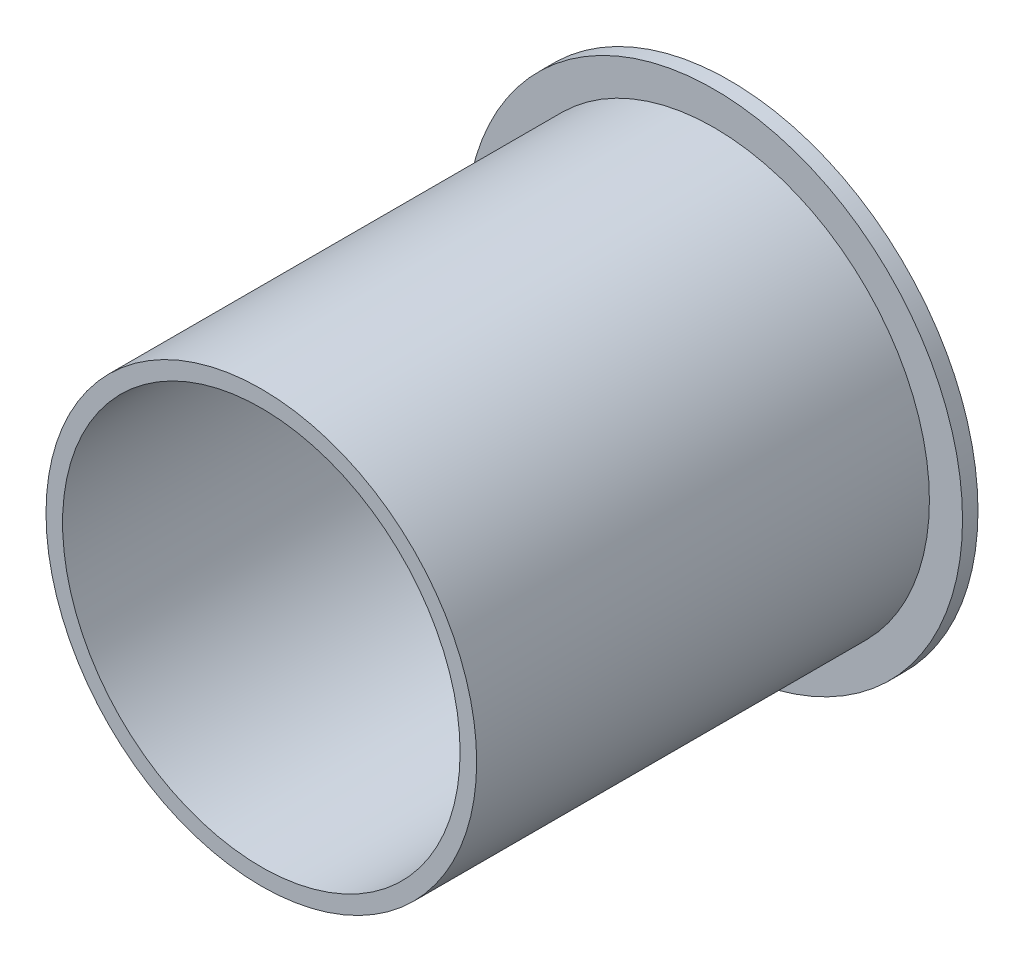
ISO-10303-21;
HEADER;
FILE_DESCRIPTION(('STEP AP214'),'2;1');
FILE_NAME('part.step','',(''),(''),'','','');
FILE_SCHEMA(('AUTOMOTIVE_DESIGN { 1 0 10303 214 1 1 1 1 }'));
ENDSEC;
DATA;
#1=APPLICATION_CONTEXT('core data for automotive mechanical design processes');
#2=APPLICATION_PROTOCOL_DEFINITION('international standard','automotive_design',2000,#1);
#3=PRODUCT_CONTEXT('',#1,'mechanical');
#4=PRODUCT('Part','Part','',(#3));
#5=PRODUCT_RELATED_PRODUCT_CATEGORY('part','',(#4));
#6=PRODUCT_DEFINITION_FORMATION('','',#4);
#7=PRODUCT_DEFINITION_CONTEXT('part definition',#1,'design');
#8=PRODUCT_DEFINITION('design','',#6,#7);
#9=PRODUCT_DEFINITION_SHAPE('','',#8);
#10=(LENGTH_UNIT() NAMED_UNIT(*) SI_UNIT(.MILLI.,.METRE.));
#11=(NAMED_UNIT(*) PLANE_ANGLE_UNIT() SI_UNIT($,.RADIAN.));
#12=(NAMED_UNIT(*) SI_UNIT($,.STERADIAN.) SOLID_ANGLE_UNIT());
#13=UNCERTAINTY_MEASURE_WITH_UNIT(LENGTH_MEASURE(1.E-05),#10,'distance_accuracy_value','');
#14=(GEOMETRIC_REPRESENTATION_CONTEXT(3) GLOBAL_UNCERTAINTY_ASSIGNED_CONTEXT((#13)) GLOBAL_UNIT_ASSIGNED_CONTEXT((#10,
#11,#12)) REPRESENTATION_CONTEXT('',''));
#15=CARTESIAN_POINT('',(0.,0.,0.));
#16=DIRECTION('',(0.,0.,1.));
#17=DIRECTION('',(1.,0.,0.));
#18=AXIS2_PLACEMENT_3D('',#15,#16,#17);
#19=CARTESIAN_POINT('',(0.,0.,1.4));
#20=DIRECTION('',(0.,0.,-1.));
#21=DIRECTION('',(-1.,0.,0.));
#22=AXIS2_PLACEMENT_3D('',#19,#20,#21);
#23=CYLINDRICAL_SURFACE('',#22,22.5);
#24=CARTESIAN_POINT('',(0.,0.,1.4));
#25=DIRECTION('',(0.,0.,1.));
#26=DIRECTION('',(1.,0.,0.));
#27=AXIS2_PLACEMENT_3D('',#24,#25,#26);
#28=CIRCLE('',#27,22.5);
#29=CARTESIAN_POINT('',(22.5,0.,1.4));
#30=VERTEX_POINT('',#29);
#31=EDGE_CURVE('E41',#30,#30,#28,.T.);
#32=ORIENTED_EDGE('',*,*,#31,.F.);
#33=EDGE_LOOP('',(#32));
#34=FACE_BOUND('',#33,.T.);
#35=CARTESIAN_POINT('',(0.,0.,0.));
#36=DIRECTION('',(0.,0.,1.));
#37=DIRECTION('',(1.,0.,0.));
#38=AXIS2_PLACEMENT_3D('',#35,#36,#37);
#39=CIRCLE('',#38,22.5);
#40=CARTESIAN_POINT('',(22.5,0.,0.));
#41=VERTEX_POINT('',#40);
#42=EDGE_CURVE('E45',#41,#41,#39,.T.);
#43=ORIENTED_EDGE('',*,*,#42,.T.);
#44=EDGE_LOOP('',(#43));
#45=FACE_BOUND('',#44,.T.);
#46=ADVANCED_FACE('F35',(#34,#45),#23,.T.);
#47=CARTESIAN_POINT('',(0.,0.,1.4));
#48=DIRECTION('',(0.,0.,1.));
#49=DIRECTION('',(1.,0.,0.));
#50=AXIS2_PLACEMENT_3D('',#47,#48,#49);
#51=PLANE('',#50);
#52=CARTESIAN_POINT('',(0.,0.,1.4));
#53=DIRECTION('',(0.,0.,1.));
#54=DIRECTION('',(1.,0.,0.));
#55=AXIS2_PLACEMENT_3D('',#52,#53,#54);
#56=CIRCLE('',#55,19.5);
#57=CARTESIAN_POINT('',(19.5,0.,1.4));
#58=VERTEX_POINT('',#57);
#59=EDGE_CURVE('E52',#58,#58,#56,.T.);
#60=ORIENTED_EDGE('',*,*,#59,.F.);
#61=EDGE_LOOP('',(#60));
#62=FACE_BOUND('',#61,.T.);
#63=ORIENTED_EDGE('',*,*,#31,.T.);
#64=EDGE_LOOP('',(#63));
#65=FACE_BOUND('',#64,.T.);
#66=ADVANCED_FACE('F74',(#62,#65),#51,.T.);
#67=CARTESIAN_POINT('',(0.,0.,0.));
#68=DIRECTION('',(0.,0.,1.));
#69=DIRECTION('',(1.,0.,0.));
#70=AXIS2_PLACEMENT_3D('',#67,#68,#69);
#71=PLANE('',#70);
#72=CARTESIAN_POINT('',(0.,0.,0.));
#73=DIRECTION('',(0.,0.,1.));
#74=DIRECTION('',(1.,0.,0.));
#75=AXIS2_PLACEMENT_3D('',#72,#73,#74);
#76=CIRCLE('',#75,17.);
#77=CARTESIAN_POINT('',(17.,0.,0.));
#78=VERTEX_POINT('',#77);
#79=EDGE_CURVE('E60',#78,#78,#76,.F.);
#80=ORIENTED_EDGE('',*,*,#79,.F.);
#81=EDGE_LOOP('',(#80));
#82=FACE_BOUND('',#81,.T.);
#83=ORIENTED_EDGE('',*,*,#42,.F.);
#84=EDGE_LOOP('',(#83));
#85=FACE_BOUND('',#84,.T.);
#86=ADVANCED_FACE('F86',(#82,#85),#71,.F.);
#87=CARTESIAN_POINT('',(0.,0.,42.4));
#88=DIRECTION('',(0.,0.,1.));
#89=DIRECTION('',(1.,0.,0.));
#90=AXIS2_PLACEMENT_3D('',#87,#88,#89);
#91=PLANE('',#90);
#92=CARTESIAN_POINT('',(0.,0.,42.4));
#93=DIRECTION('',(0.,0.,1.));
#94=DIRECTION('',(1.,0.,0.));
#95=AXIS2_PLACEMENT_3D('',#92,#93,#94);
#96=CIRCLE('',#95,19.5);
#97=CARTESIAN_POINT('',(19.5,0.,42.4));
#98=VERTEX_POINT('',#97);
#99=EDGE_CURVE('E50',#98,#98,#96,.T.);
#100=ORIENTED_EDGE('',*,*,#99,.T.);
#101=EDGE_LOOP('',(#100));
#102=FACE_BOUND('',#101,.T.);
#103=CARTESIAN_POINT('',(0.,0.,42.4));
#104=DIRECTION('',(0.,0.,1.));
#105=DIRECTION('',(1.,0.,0.));
#106=AXIS2_PLACEMENT_3D('',#103,#104,#105);
#107=CIRCLE('',#106,18.);
#108=CARTESIAN_POINT('',(18.,0.,42.4));
#109=VERTEX_POINT('',#108);
#110=EDGE_CURVE('E55',#109,#109,#107,.T.);
#111=ORIENTED_EDGE('',*,*,#110,.F.);
#112=EDGE_LOOP('',(#111));
#113=FACE_BOUND('',#112,.T.);
#114=ADVANCED_FACE('F96',(#102,#113),#91,.T.);
#115=CARTESIAN_POINT('',(0.,0.,42.4));
#116=DIRECTION('',(0.,0.,-1.));
#117=DIRECTION('',(-1.,0.,0.));
#118=AXIS2_PLACEMENT_3D('',#115,#116,#117);
#119=CYLINDRICAL_SURFACE('',#118,19.5);
#120=ORIENTED_EDGE('',*,*,#99,.F.);
#121=EDGE_LOOP('',(#120));
#122=FACE_BOUND('',#121,.T.);
#123=ORIENTED_EDGE('',*,*,#59,.T.);
#124=EDGE_LOOP('',(#123));
#125=FACE_BOUND('',#124,.T.);
#126=ADVANCED_FACE('F81',(#122,#125),#119,.T.);
#127=CARTESIAN_POINT('',(0.,0.,42.4));
#128=DIRECTION('',(0.,0.,-1.));
#129=DIRECTION('',(-1.,0.,0.));
#130=AXIS2_PLACEMENT_3D('',#127,#128,#129);
#131=CYLINDRICAL_SURFACE('',#130,18.);
#132=ORIENTED_EDGE('',*,*,#110,.T.);
#133=EDGE_LOOP('',(#132));
#134=FACE_BOUND('',#133,.T.);
#135=CARTESIAN_POINT('',(0.,0.,1.4));
#136=DIRECTION('',(0.,0.,1.));
#137=DIRECTION('',(1.,0.,0.));
#138=AXIS2_PLACEMENT_3D('',#135,#136,#137);
#139=CIRCLE('',#138,18.);
#140=CARTESIAN_POINT('',(18.,0.,1.4));
#141=VERTEX_POINT('',#140);
#142=EDGE_CURVE('E10',#141,#141,#139,.F.);
#143=ORIENTED_EDGE('',*,*,#142,.T.);
#144=EDGE_LOOP('',(#143));
#145=FACE_BOUND('',#144,.T.);
#146=ADVANCED_FACE('F72',(#134,#145),#131,.F.);
#147=CARTESIAN_POINT('',(0.,0.,1.4));
#148=DIRECTION('',(0.,0.,1.));
#149=DIRECTION('',(1.,0.,0.));
#150=AXIS2_PLACEMENT_3D('',#147,#148,#149);
#151=CIRCLE('',#150,17.);
#152=CARTESIAN_POINT('',(17.,0.,1.4));
#153=VERTEX_POINT('',#152);
#154=EDGE_CURVE('E63',#153,#153,#151,.T.);
#155=ORIENTED_EDGE('',*,*,#154,.F.);
#156=EDGE_LOOP('',(#155));
#157=FACE_BOUND('',#156,.T.);
#158=ORIENTED_EDGE('',*,*,#142,.F.);
#159=EDGE_LOOP('',(#158));
#160=FACE_BOUND('',#159,.T.);
#161=ADVANCED_FACE('F69',(#157,#160),#51,.T.);
#162=CARTESIAN_POINT('',(0.,0.,-48.0832611206852));
#163=DIRECTION('',(0.,0.,1.));
#164=DIRECTION('',(1.,0.,0.));
#165=AXIS2_PLACEMENT_3D('',#162,#163,#164);
#166=CYLINDRICAL_SURFACE('',#165,17.);
#167=ORIENTED_EDGE('',*,*,#79,.T.);
#168=EDGE_LOOP('',(#167));
#169=FACE_BOUND('',#168,.T.);
#170=ORIENTED_EDGE('',*,*,#154,.T.);
#171=EDGE_LOOP('',(#170));
#172=FACE_BOUND('',#171,.T.);
#173=ADVANCED_FACE('F67',(#169,#172),#166,.F.);
#174=CLOSED_SHELL('',(#46,#66,#86,#114,#126,#146,#161,#173));
#175=MANIFOLD_SOLID_BREP('B2',#174);
#176=ADVANCED_BREP_SHAPE_REPRESENTATION('',(#18,#175),#14);
#177=SHAPE_DEFINITION_REPRESENTATION(#9,#176);
ENDSEC;
END-ISO-10303-21;
